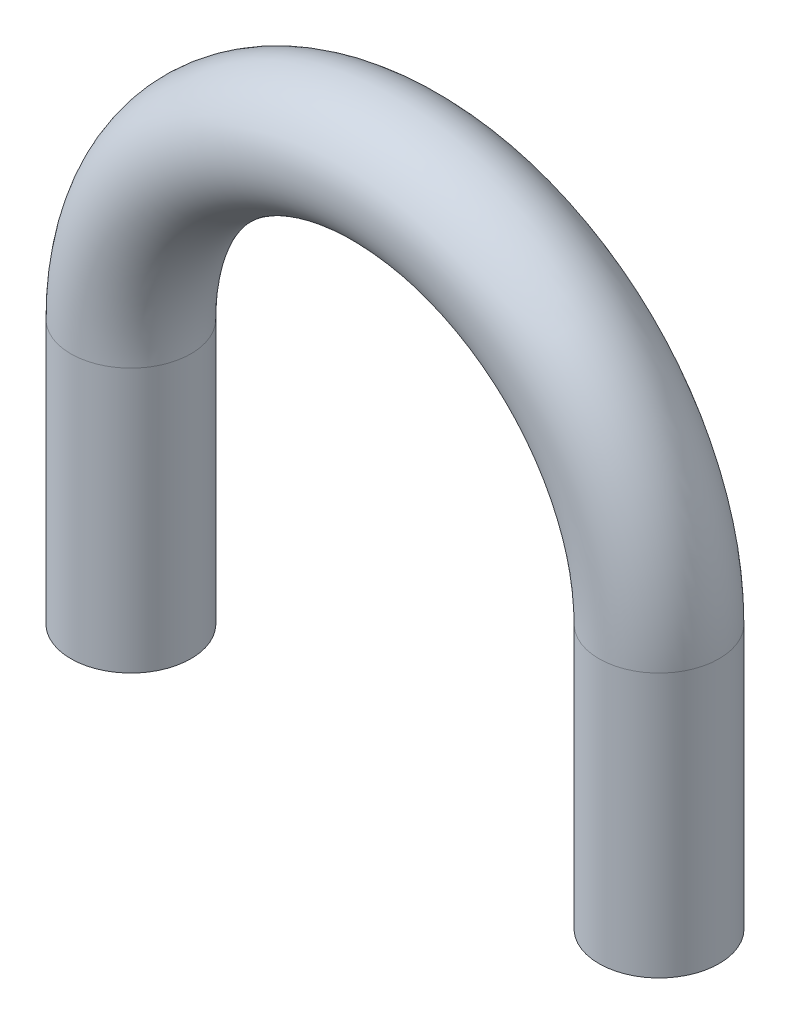
ISO-10303-21;
HEADER;
FILE_DESCRIPTION(('STEP AP214'),'2;1');
FILE_NAME('part.step','',(''),(''),'','','');
FILE_SCHEMA(('AUTOMOTIVE_DESIGN { 1 0 10303 214 1 1 1 1 }'));
ENDSEC;
DATA;
#1=APPLICATION_CONTEXT('core data for automotive mechanical design processes');
#2=APPLICATION_PROTOCOL_DEFINITION('international standard','automotive_design',2000,#1);
#3=PRODUCT_CONTEXT('',#1,'mechanical');
#4=PRODUCT('Part','Part','',(#3));
#5=PRODUCT_RELATED_PRODUCT_CATEGORY('part','',(#4));
#6=PRODUCT_DEFINITION_FORMATION('','',#4);
#7=PRODUCT_DEFINITION_CONTEXT('part definition',#1,'design');
#8=PRODUCT_DEFINITION('design','',#6,#7);
#9=PRODUCT_DEFINITION_SHAPE('','',#8);
#10=(LENGTH_UNIT() NAMED_UNIT(*) SI_UNIT(.MILLI.,.METRE.));
#11=(NAMED_UNIT(*) PLANE_ANGLE_UNIT() SI_UNIT($,.RADIAN.));
#12=(NAMED_UNIT(*) SI_UNIT($,.STERADIAN.) SOLID_ANGLE_UNIT());
#13=UNCERTAINTY_MEASURE_WITH_UNIT(LENGTH_MEASURE(1.E-05),#10,'distance_accuracy_value','');
#14=(GEOMETRIC_REPRESENTATION_CONTEXT(3) GLOBAL_UNCERTAINTY_ASSIGNED_CONTEXT((#13)) GLOBAL_UNIT_ASSIGNED_CONTEXT((#10,
#11,#12)) REPRESENTATION_CONTEXT('',''));
#15=CARTESIAN_POINT('',(0.,0.,0.));
#16=DIRECTION('',(0.,0.,1.));
#17=DIRECTION('',(1.,0.,0.));
#18=AXIS2_PLACEMENT_3D('',#15,#16,#17);
#19=CARTESIAN_POINT('',(2.,0.,0.));
#20=DIRECTION('',(0.,1.,0.));
#21=DIRECTION('',(0.,0.,1.));
#22=AXIS2_PLACEMENT_3D('',#19,#20,#21);
#23=PLANE('',#22);
#24=CARTESIAN_POINT('',(2.,0.,0.));
#25=DIRECTION('',(0.,1.,0.));
#26=DIRECTION('',(0.,0.,1.));
#27=AXIS2_PLACEMENT_3D('',#24,#25,#26);
#28=CIRCLE('',#27,0.455);
#29=CARTESIAN_POINT('',(2.,0.,0.455));
#30=VERTEX_POINT('',#29);
#31=EDGE_CURVE('E65',#30,#30,#28,.T.);
#32=ORIENTED_EDGE('',*,*,#31,.F.);
#33=EDGE_LOOP('',(#32));
#34=FACE_BOUND('',#33,.T.);
#35=ADVANCED_FACE('F51',(#34),#23,.F.);
#36=CARTESIAN_POINT('',(-2.,0.,0.));
#37=DIRECTION('',(0.,-1.,0.));
#38=DIRECTION('',(0.,0.,1.));
#39=AXIS2_PLACEMENT_3D('',#36,#37,#38);
#40=PLANE('',#39);
#41=CARTESIAN_POINT('',(-2.,0.,0.));
#42=DIRECTION('',(0.,-1.,0.));
#43=DIRECTION('',(0.,0.,1.));
#44=AXIS2_PLACEMENT_3D('',#41,#42,#43);
#45=CIRCLE('',#44,0.455);
#46=CARTESIAN_POINT('',(-2.,0.,0.455));
#47=VERTEX_POINT('',#46);
#48=EDGE_CURVE('E11',#47,#47,#45,.T.);
#49=ORIENTED_EDGE('',*,*,#48,.T.);
#50=EDGE_LOOP('',(#49));
#51=FACE_BOUND('',#50,.T.);
#52=ADVANCED_FACE('F74',(#51),#40,.T.);
#53=CARTESIAN_POINT('',(2.,0.,0.));
#54=DIRECTION('',(0.,1.,0.));
#55=DIRECTION('',(0.,0.,1.));
#56=AXIS2_PLACEMENT_3D('',#53,#54,#55);
#57=CYLINDRICAL_SURFACE('',#56,0.455);
#58=CARTESIAN_POINT('',(2.,2.,0.));
#59=DIRECTION('',(0.,1.,0.));
#60=DIRECTION('',(0.,0.,1.));
#61=AXIS2_PLACEMENT_3D('',#58,#59,#60);
#62=CIRCLE('',#61,0.455);
#63=CARTESIAN_POINT('',(2.455,2.,0.));
#64=VERTEX_POINT('',#63);
#65=EDGE_CURVE('E61',#64,#64,#62,.T.);
#66=ORIENTED_EDGE('',*,*,#65,.F.);
#67=EDGE_LOOP('',(#66));
#68=FACE_BOUND('',#67,.T.);
#69=ORIENTED_EDGE('',*,*,#31,.T.);
#70=EDGE_LOOP('',(#69));
#71=FACE_BOUND('',#70,.T.);
#72=ADVANCED_FACE('F71',(#68,#71),#57,.T.);
#73=CARTESIAN_POINT('',(0.,2.,0.));
#74=DIRECTION('',(0.,0.,1.));
#75=DIRECTION('',(1.,0.,0.));
#76=AXIS2_PLACEMENT_3D('',#73,#74,#75);
#77=TOROIDAL_SURFACE('',#76,2.,0.455);
#78=CARTESIAN_POINT('',(-2.,2.,0.));
#79=DIRECTION('',(0.,-1.,0.));
#80=DIRECTION('',(0.,0.,1.));
#81=AXIS2_PLACEMENT_3D('',#78,#79,#80);
#82=CIRCLE('',#81,0.455);
#83=CARTESIAN_POINT('',(-2.455,2.,0.));
#84=VERTEX_POINT('',#83);
#85=EDGE_CURVE('E57',#84,#84,#82,.T.);
#86=CARTESIAN_POINT('',(0.,2.,0.));
#87=DIRECTION('',(0.,0.,1.));
#88=DIRECTION('',(1.,0.,0.));
#89=AXIS2_PLACEMENT_3D('',#86,#87,#88);
#90=CIRCLE('',#89,2.455);
#91=EDGE_CURVE('',#64,#84,#90,.T.);
#92=ORIENTED_EDGE('',*,*,#65,.T.);
#93=ORIENTED_EDGE('',*,*,#85,.F.);
#94=ORIENTED_EDGE('',*,*,#91,.T.);
#95=ORIENTED_EDGE('',*,*,#91,.F.);
#96=EDGE_LOOP('',(#92,#94,#93,#95));
#97=FACE_BOUND('',#96,.T.);
#98=ADVANCED_FACE('F80',(#97),#77,.T.);
#99=CARTESIAN_POINT('',(-2.,2.,0.));
#100=DIRECTION('',(0.,-1.,0.));
#101=DIRECTION('',(1.,0.,0.));
#102=AXIS2_PLACEMENT_3D('',#99,#100,#101);
#103=CYLINDRICAL_SURFACE('',#102,0.455);
#104=ORIENTED_EDGE('',*,*,#48,.F.);
#105=EDGE_LOOP('',(#104));
#106=FACE_BOUND('',#105,.T.);
#107=ORIENTED_EDGE('',*,*,#85,.T.);
#108=EDGE_LOOP('',(#107));
#109=FACE_BOUND('',#108,.T.);
#110=ADVANCED_FACE('F78',(#106,#109),#103,.T.);
#111=CLOSED_SHELL('',(#35,#52,#72,#98,#110));
#112=MANIFOLD_SOLID_BREP('B2',#111);
#113=ADVANCED_BREP_SHAPE_REPRESENTATION('',(#18,#112),#14);
#114=SHAPE_DEFINITION_REPRESENTATION(#9,#113);
ENDSEC;
END-ISO-10303-21;
